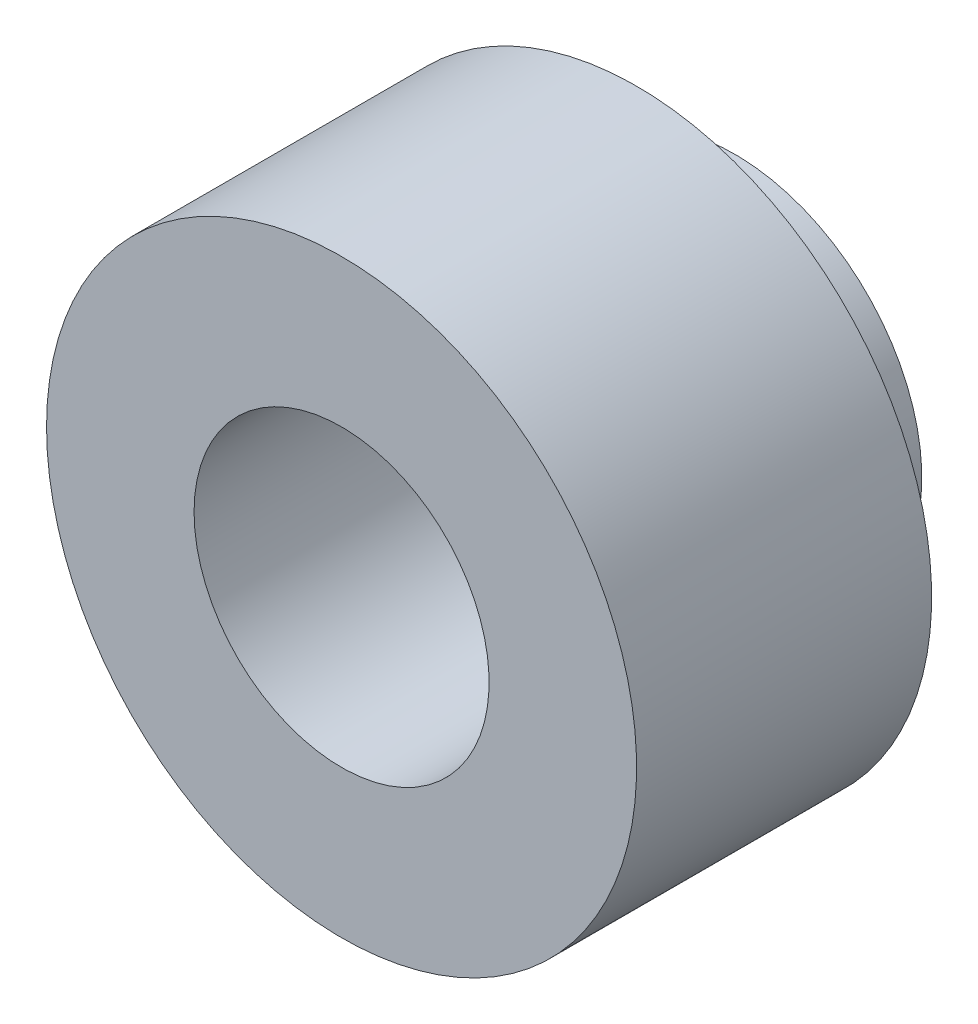
ISO-10303-21;
HEADER;
FILE_DESCRIPTION(('STEP AP214'),'2;1');
FILE_NAME('part.step','',(''),(''),'','','');
FILE_SCHEMA(('AUTOMOTIVE_DESIGN { 1 0 10303 214 1 1 1 1 }'));
ENDSEC;
DATA;
#1=APPLICATION_CONTEXT('core data for automotive mechanical design processes');
#2=APPLICATION_PROTOCOL_DEFINITION('international standard','automotive_design',2000,#1);
#3=PRODUCT_CONTEXT('',#1,'mechanical');
#4=PRODUCT('Part','Part','',(#3));
#5=PRODUCT_RELATED_PRODUCT_CATEGORY('part','',(#4));
#6=PRODUCT_DEFINITION_FORMATION('','',#4);
#7=PRODUCT_DEFINITION_CONTEXT('part definition',#1,'design');
#8=PRODUCT_DEFINITION('design','',#6,#7);
#9=PRODUCT_DEFINITION_SHAPE('','',#8);
#10=(LENGTH_UNIT() NAMED_UNIT(*) SI_UNIT(.MILLI.,.METRE.));
#11=(NAMED_UNIT(*) PLANE_ANGLE_UNIT() SI_UNIT($,.RADIAN.));
#12=(NAMED_UNIT(*) SI_UNIT($,.STERADIAN.) SOLID_ANGLE_UNIT());
#13=UNCERTAINTY_MEASURE_WITH_UNIT(LENGTH_MEASURE(1.E-05),#10,'distance_accuracy_value','');
#14=(GEOMETRIC_REPRESENTATION_CONTEXT(3) GLOBAL_UNCERTAINTY_ASSIGNED_CONTEXT((#13)) GLOBAL_UNIT_ASSIGNED_CONTEXT((#10,
#11,#12)) REPRESENTATION_CONTEXT('',''));
#15=CARTESIAN_POINT('',(0.,0.,0.));
#16=DIRECTION('',(0.,0.,1.));
#17=DIRECTION('',(1.,0.,0.));
#18=AXIS2_PLACEMENT_3D('',#15,#16,#17);
#19=CARTESIAN_POINT('',(0.,0.,-567.324866616421));
#20=DIRECTION('',(0.,0.,-1.));
#21=DIRECTION('',(-1.,0.,0.));
#22=AXIS2_PLACEMENT_3D('',#19,#20,#21);
#23=CYLINDRICAL_SURFACE('',#22,187.5);
#24=CARTESIAN_POINT('',(0.,0.,-500.));
#25=DIRECTION('',(0.,0.,-1.));
#26=DIRECTION('',(-1.,0.,0.));
#27=AXIS2_PLACEMENT_3D('',#24,#25,#26);
#28=CIRCLE('',#27,187.5);
#29=CARTESIAN_POINT('',(-187.5,0.,-500.));
#30=VERTEX_POINT('',#29);
#31=EDGE_CURVE('E53',#30,#30,#28,.T.);
#32=ORIENTED_EDGE('',*,*,#31,.T.);
#33=EDGE_LOOP('',(#32));
#34=FACE_BOUND('',#33,.T.);
#35=CARTESIAN_POINT('',(0.,0.,0.));
#36=DIRECTION('',(0.,0.,-1.));
#37=DIRECTION('',(-1.,0.,0.));
#38=AXIS2_PLACEMENT_3D('',#35,#36,#37);
#39=CIRCLE('',#38,187.5);
#40=CARTESIAN_POINT('',(-187.5,0.,0.));
#41=VERTEX_POINT('',#40);
#42=EDGE_CURVE('E10',#41,#41,#39,.T.);
#43=ORIENTED_EDGE('',*,*,#42,.F.);
#44=EDGE_LOOP('',(#43));
#45=FACE_BOUND('',#44,.T.);
#46=ADVANCED_FACE('F31',(#34,#45),#23,.F.);
#47=CARTESIAN_POINT('',(-187.5,0.,0.));
#48=DIRECTION('',(0.,0.,1.));
#49=DIRECTION('',(1.,0.,0.));
#50=AXIS2_PLACEMENT_3D('',#47,#48,#49);
#51=PLANE('',#50);
#52=ORIENTED_EDGE('',*,*,#42,.T.);
#53=EDGE_LOOP('',(#52));
#54=FACE_BOUND('',#53,.T.);
#55=CARTESIAN_POINT('',(0.,0.,0.));
#56=DIRECTION('',(0.,0.,-1.));
#57=DIRECTION('',(-1.,0.,0.));
#58=AXIS2_PLACEMENT_3D('',#55,#56,#57);
#59=CIRCLE('',#58,375.);
#60=CARTESIAN_POINT('',(-375.,0.,0.));
#61=VERTEX_POINT('',#60);
#62=EDGE_CURVE('E37',#61,#61,#59,.T.);
#63=ORIENTED_EDGE('',*,*,#62,.F.);
#64=EDGE_LOOP('',(#63));
#65=FACE_BOUND('',#64,.T.);
#66=ADVANCED_FACE('F71',(#54,#65),#51,.T.);
#67=CARTESIAN_POINT('',(0.,0.,-567.324866616421));
#68=DIRECTION('',(0.,0.,-1.));
#69=DIRECTION('',(-1.,0.,0.));
#70=AXIS2_PLACEMENT_3D('',#67,#68,#69);
#71=CYLINDRICAL_SURFACE('',#70,375.);
#72=ORIENTED_EDGE('',*,*,#62,.T.);
#73=EDGE_LOOP('',(#72));
#74=FACE_BOUND('',#73,.T.);
#75=CARTESIAN_POINT('',(0.,0.,-375.));
#76=DIRECTION('',(0.,0.,-1.));
#77=DIRECTION('',(-1.,0.,0.));
#78=AXIS2_PLACEMENT_3D('',#75,#76,#77);
#79=CIRCLE('',#78,375.);
#80=CARTESIAN_POINT('',(-375.,0.,-375.));
#81=VERTEX_POINT('',#80);
#82=EDGE_CURVE('E41',#81,#81,#79,.T.);
#83=ORIENTED_EDGE('',*,*,#82,.F.);
#84=EDGE_LOOP('',(#83));
#85=FACE_BOUND('',#84,.T.);
#86=ADVANCED_FACE('F75',(#74,#85),#71,.T.);
#87=CARTESIAN_POINT('',(-375.,0.,-375.));
#88=DIRECTION('',(0.,0.,-1.));
#89=DIRECTION('',(-1.,0.,0.));
#90=AXIS2_PLACEMENT_3D('',#87,#88,#89);
#91=PLANE('',#90);
#92=ORIENTED_EDGE('',*,*,#82,.T.);
#93=EDGE_LOOP('',(#92));
#94=FACE_BOUND('',#93,.T.);
#95=CARTESIAN_POINT('',(0.,0.,-375.));
#96=DIRECTION('',(0.,0.,-1.));
#97=DIRECTION('',(-1.,0.,0.));
#98=AXIS2_PLACEMENT_3D('',#95,#96,#97);
#99=CIRCLE('',#98,237.5);
#100=CARTESIAN_POINT('',(-237.5,0.,-375.));
#101=VERTEX_POINT('',#100);
#102=EDGE_CURVE('E45',#101,#101,#99,.T.);
#103=ORIENTED_EDGE('',*,*,#102,.F.);
#104=EDGE_LOOP('',(#103));
#105=FACE_BOUND('',#104,.T.);
#106=ADVANCED_FACE('F67',(#94,#105),#91,.T.);
#107=CARTESIAN_POINT('',(0.,0.,-567.324866616421));
#108=DIRECTION('',(0.,0.,-1.));
#109=DIRECTION('',(-1.,0.,0.));
#110=AXIS2_PLACEMENT_3D('',#107,#108,#109);
#111=CYLINDRICAL_SURFACE('',#110,237.5);
#112=ORIENTED_EDGE('',*,*,#102,.T.);
#113=EDGE_LOOP('',(#112));
#114=FACE_BOUND('',#113,.T.);
#115=CARTESIAN_POINT('',(0.,0.,-500.));
#116=DIRECTION('',(0.,0.,-1.));
#117=DIRECTION('',(-1.,0.,0.));
#118=AXIS2_PLACEMENT_3D('',#115,#116,#117);
#119=CIRCLE('',#118,237.5);
#120=CARTESIAN_POINT('',(-237.5,0.,-500.));
#121=VERTEX_POINT('',#120);
#122=EDGE_CURVE('E50',#121,#121,#119,.T.);
#123=ORIENTED_EDGE('',*,*,#122,.F.);
#124=EDGE_LOOP('',(#123));
#125=FACE_BOUND('',#124,.T.);
#126=ADVANCED_FACE('F61',(#114,#125),#111,.T.);
#127=CARTESIAN_POINT('',(-237.5,0.,-500.));
#128=DIRECTION('',(0.,0.,-1.));
#129=DIRECTION('',(-1.,0.,0.));
#130=AXIS2_PLACEMENT_3D('',#127,#128,#129);
#131=PLANE('',#130);
#132=ORIENTED_EDGE('',*,*,#122,.T.);
#133=EDGE_LOOP('',(#132));
#134=FACE_BOUND('',#133,.T.);
#135=ORIENTED_EDGE('',*,*,#31,.F.);
#136=EDGE_LOOP('',(#135));
#137=FACE_BOUND('',#136,.T.);
#138=ADVANCED_FACE('F59',(#134,#137),#131,.T.);
#139=CLOSED_SHELL('',(#46,#66,#86,#106,#126,#138));
#140=MANIFOLD_SOLID_BREP('B2',#139);
#141=ADVANCED_BREP_SHAPE_REPRESENTATION('',(#18,#140),#14);
#142=SHAPE_DEFINITION_REPRESENTATION(#9,#141);
ENDSEC;
END-ISO-10303-21;
